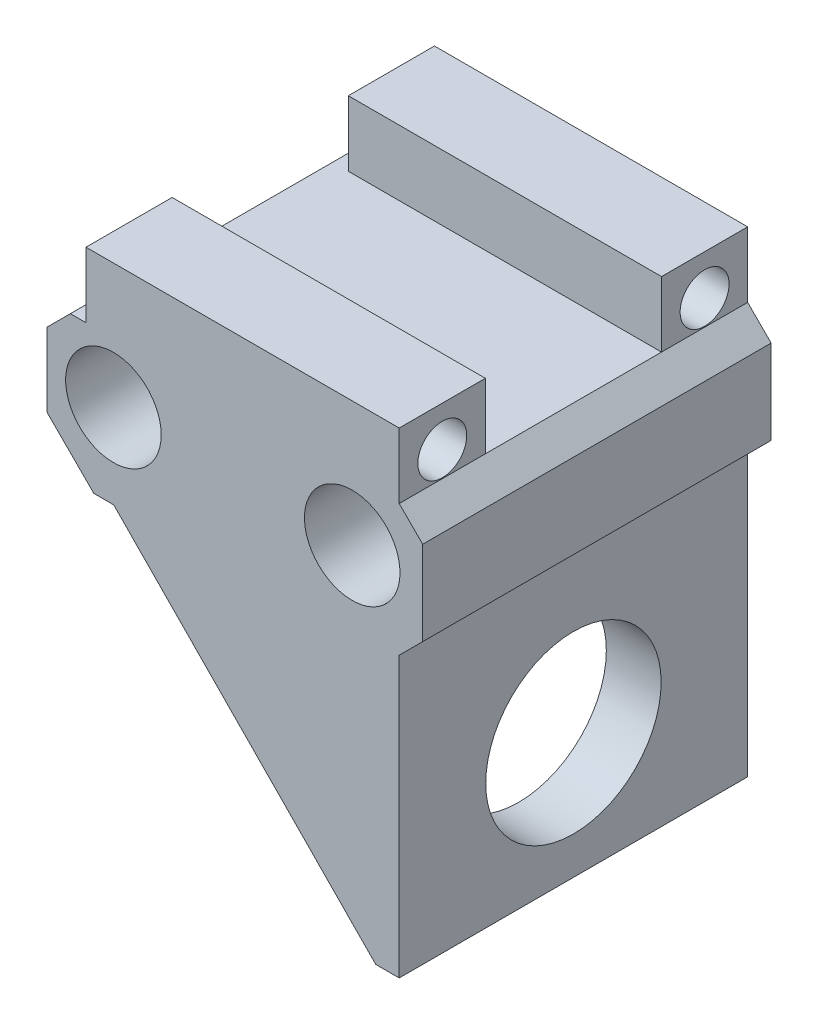
ISO-10303-21;
HEADER;
FILE_DESCRIPTION(('STEP AP214'),'2;1');
FILE_NAME('part.step','',(''),(''),'','','');
FILE_SCHEMA(('AUTOMOTIVE_DESIGN { 1 0 10303 214 1 1 1 1 }'));
ENDSEC;
DATA;
#1=APPLICATION_CONTEXT('core data for automotive mechanical design processes');
#2=APPLICATION_PROTOCOL_DEFINITION('international standard','automotive_design',2000,#1);
#3=PRODUCT_CONTEXT('',#1,'mechanical');
#4=PRODUCT('Part','Part','',(#3));
#5=PRODUCT_RELATED_PRODUCT_CATEGORY('part','',(#4));
#6=PRODUCT_DEFINITION_FORMATION('','',#4);
#7=PRODUCT_DEFINITION_CONTEXT('part definition',#1,'design');
#8=PRODUCT_DEFINITION('design','',#6,#7);
#9=PRODUCT_DEFINITION_SHAPE('','',#8);
#10=(LENGTH_UNIT() NAMED_UNIT(*) SI_UNIT(.MILLI.,.METRE.));
#11=(NAMED_UNIT(*) PLANE_ANGLE_UNIT() SI_UNIT($,.RADIAN.));
#12=(NAMED_UNIT(*) SI_UNIT($,.STERADIAN.) SOLID_ANGLE_UNIT());
#13=UNCERTAINTY_MEASURE_WITH_UNIT(LENGTH_MEASURE(1.E-05),#10,'distance_accuracy_value','');
#14=(GEOMETRIC_REPRESENTATION_CONTEXT(3) GLOBAL_UNCERTAINTY_ASSIGNED_CONTEXT((#13)) GLOBAL_UNIT_ASSIGNED_CONTEXT((#10,
#11,#12)) REPRESENTATION_CONTEXT('',''));
#15=CARTESIAN_POINT('',(0.,0.,0.));
#16=DIRECTION('',(0.,0.,1.));
#17=DIRECTION('',(1.,0.,0.));
#18=AXIS2_PLACEMENT_3D('',#15,#16,#17);
#19=CARTESIAN_POINT('',(4.59650099748462,-23.964355104519,42.5));
#20=DIRECTION('',(-1.,0.,0.));
#21=DIRECTION('',(0.,0.,1.));
#22=AXIS2_PLACEMENT_3D('',#19,#20,#21);
#23=PLANE('',#22);
#24=CARTESIAN_POINT('',(4.59650099748462,39.1139278229734,4.50000000000002));
#25=DIRECTION('',(1.,0.,0.));
#26=DIRECTION('',(0.,0.,1.));
#27=AXIS2_PLACEMENT_3D('',#24,#25,#26);
#28=CIRCLE('',#27,3.125);
#29=CARTESIAN_POINT('',(4.59650099748462,39.1139278229734,7.62500000000002));
#30=VERTEX_POINT('',#29);
#31=EDGE_CURVE('E356',#30,#30,#28,.T.);
#32=ORIENTED_EDGE('',*,*,#31,.F.);
#33=EDGE_LOOP('',(#32));
#34=FACE_BOUND('',#33,.T.);
#35=DIRECTION('',(0.,0.,1.));
#36=VECTOR('',#35,1.);
#37=CARTESIAN_POINT('',(4.59650099748462,35.885644895481,-0.999999999999994));
#38=LINE('',#37,#36);
#39=CARTESIAN_POINT('',(4.59650099748462,35.885644895481,-0.999999999999994));
#40=VERTEX_POINT('',#39);
#41=CARTESIAN_POINT('',(4.59650099748462,35.885644895481,10.));
#42=VERTEX_POINT('',#41);
#43=EDGE_CURVE('E237',#40,#42,#38,.T.);
#44=ORIENTED_EDGE('',*,*,#43,.F.);
#45=DIRECTION('',(0.,-1.,0.));
#46=VECTOR('',#45,1.);
#47=CARTESIAN_POINT('',(4.59650099748462,44.2389278229734,-1.));
#48=LINE('',#47,#46);
#49=CARTESIAN_POINT('',(4.59650099748462,44.2389278229734,-1.));
#50=VERTEX_POINT('',#49);
#51=EDGE_CURVE('E303',#50,#40,#48,.T.);
#52=ORIENTED_EDGE('',*,*,#51,.F.);
#53=DIRECTION('',(0.,0.,1.));
#54=VECTOR('',#53,1.);
#55=CARTESIAN_POINT('',(4.59650099748462,44.2389278229734,9.));
#56=LINE('',#55,#54);
#57=CARTESIAN_POINT('',(4.59650099748462,44.2389278229734,10.));
#58=VERTEX_POINT('',#57);
#59=EDGE_CURVE('E359',#50,#58,#56,.T.);
#60=ORIENTED_EDGE('',*,*,#59,.T.);
#61=DIRECTION('',(0.,-1.,0.));
#62=VECTOR('',#61,1.);
#63=CARTESIAN_POINT('',(4.59650099748462,44.2389278229734,10.));
#64=LINE('',#63,#62);
#65=EDGE_CURVE('E322',#58,#42,#64,.T.);
#66=ORIENTED_EDGE('',*,*,#65,.T.);
#67=EDGE_LOOP('',(#44,#52,#60,#66));
#68=FACE_BOUND('',#67,.T.);
#69=ADVANCED_FACE('F45',(#34,#68),#23,.F.);
#70=CARTESIAN_POINT('',(4.59650099748462,39.1139278229734,38.));
#71=DIRECTION('',(1.,0.,0.));
#72=DIRECTION('',(0.,0.,-1.));
#73=AXIS2_PLACEMENT_3D('',#70,#71,#72);
#74=CIRCLE('',#73,3.125);
#75=CARTESIAN_POINT('',(4.59650099748462,39.1139278229734,34.875));
#76=VERTEX_POINT('',#75);
#77=EDGE_CURVE('E361',#76,#76,#74,.T.);
#78=ORIENTED_EDGE('',*,*,#77,.F.);
#79=EDGE_LOOP('',(#78));
#80=FACE_BOUND('',#79,.T.);
#81=CARTESIAN_POINT('',(4.59650099748462,35.885644895481,32.5));
#82=VERTEX_POINT('',#81);
#83=CARTESIAN_POINT('',(4.59650099748462,35.885644895481,43.5));
#84=VERTEX_POINT('',#83);
#85=EDGE_CURVE('E241',#82,#84,#38,.T.);
#86=ORIENTED_EDGE('',*,*,#85,.F.);
#87=DIRECTION('',(0.,1.,0.));
#88=VECTOR('',#87,1.);
#89=CARTESIAN_POINT('',(4.59650099748462,44.2389278229734,32.5));
#90=LINE('',#89,#88);
#91=CARTESIAN_POINT('',(4.59650099748462,44.2389278229734,32.5));
#92=VERTEX_POINT('',#91);
#93=EDGE_CURVE('E328',#82,#92,#90,.T.);
#94=ORIENTED_EDGE('',*,*,#93,.T.);
#95=DIRECTION('',(0.,0.,1.));
#96=VECTOR('',#95,1.);
#97=CARTESIAN_POINT('',(4.59650099748462,44.2389278229734,33.5));
#98=LINE('',#97,#96);
#99=CARTESIAN_POINT('',(4.59650099748462,44.2389278229734,43.5));
#100=VERTEX_POINT('',#99);
#101=EDGE_CURVE('E364',#92,#100,#98,.T.);
#102=ORIENTED_EDGE('',*,*,#101,.T.);
#103=DIRECTION('',(0.,1.,0.));
#104=VECTOR('',#103,1.);
#105=CARTESIAN_POINT('',(4.59650099748462,-16.589261485104,43.5));
#106=LINE('',#105,#104);
#107=EDGE_CURVE('E316',#84,#100,#106,.T.);
#108=ORIENTED_EDGE('',*,*,#107,.F.);
#109=EDGE_LOOP('',(#86,#94,#102,#108));
#110=FACE_BOUND('',#109,.T.);
#111=ADVANCED_FACE('F419',(#80,#110),#23,.F.);
#112=CARTESIAN_POINT('',(-37.9034990025154,23.663238514896,43.5));
#113=DIRECTION('',(0.713746874568225,0.700403740027201,0.));
#114=DIRECTION('',(-0.700403740027201,0.713746874568225,0.));
#115=AXIS2_PLACEMENT_3D('',#112,#113,#114);
#116=PLANE('',#115);
#117=DIRECTION('',(0.700403740027201,-0.713746874568225,0.));
#118=VECTOR('',#117,1.);
#119=CARTESIAN_POINT('',(-37.9034990025154,23.663238514896,43.5));
#120=LINE('',#119,#118);
#121=CARTESIAN_POINT('',(-31.861912382931,17.5065558464196,43.5));
#122=VERTEX_POINT('',#121);
#123=CARTESIAN_POINT('',(1.59650099748462,-16.589261485104,43.5));
#124=VERTEX_POINT('',#123);
#125=EDGE_CURVE('E311',#122,#124,#120,.T.);
#126=ORIENTED_EDGE('',*,*,#125,.F.);
#127=DIRECTION('',(0.,0.,1.));
#128=VECTOR('',#127,1.);
#129=CARTESIAN_POINT('',(-31.861912382931,17.5065558464196,-0.999999999999994));
#130=LINE('',#129,#128);
#131=CARTESIAN_POINT('',(-31.861912382931,17.5065558464196,40.));
#132=VERTEX_POINT('',#131);
#133=EDGE_CURVE('E249',#132,#122,#130,.T.);
#134=ORIENTED_EDGE('',*,*,#133,.F.);
#135=DIRECTION('',(0.700403740027201,-0.713746874568225,0.));
#136=VECTOR('',#135,1.);
#137=CARTESIAN_POINT('',(-34.9320698642422,20.6352017708873,40.));
#138=LINE('',#137,#136);
#139=CARTESIAN_POINT('',(1.59650099748462,-16.589261485104,40.));
#140=VERTEX_POINT('',#139);
#141=EDGE_CURVE('E297',#132,#140,#138,.T.);
#142=ORIENTED_EDGE('',*,*,#141,.T.);
#143=DIRECTION('',(0.,0.,1.));
#144=VECTOR('',#143,1.);
#145=CARTESIAN_POINT('',(1.59650099748462,-16.589261485104,40.));
#146=LINE('',#145,#144);
#147=EDGE_CURVE('E340',#140,#124,#146,.T.);
#148=ORIENTED_EDGE('',*,*,#147,.T.);
#149=EDGE_LOOP('',(#126,#134,#142,#148));
#150=FACE_BOUND('',#149,.T.);
#151=ADVANCED_FACE('F426',(#150),#116,.F.);
#152=CARTESIAN_POINT('',(-2.40349900251538,44.2389278229734,32.5));
#153=DIRECTION('',(0.,0.,-1.));
#154=DIRECTION('',(-1.,0.,0.));
#155=AXIS2_PLACEMENT_3D('',#152,#153,#154);
#156=PLANE('',#155);
#157=DIRECTION('',(1.,0.,0.));
#158=VECTOR('',#157,1.);
#159=CARTESIAN_POINT('',(-38.4034990025154,35.885644895481,32.5));
#160=LINE('',#159,#158);
#161=CARTESIAN_POINT('',(-35.4034990025154,35.885644895481,32.5));
#162=VERTEX_POINT('',#161);
#163=EDGE_CURVE('E267',#162,#82,#160,.T.);
#164=ORIENTED_EDGE('',*,*,#163,.F.);
#165=DIRECTION('',(0.,1.,0.));
#166=VECTOR('',#165,1.);
#167=CARTESIAN_POINT('',(-35.4034990025154,44.2389278229734,32.5));
#168=LINE('',#167,#166);
#169=CARTESIAN_POINT('',(-35.4034990025154,44.2389278229734,32.5));
#170=VERTEX_POINT('',#169);
#171=EDGE_CURVE('E289',#162,#170,#168,.T.);
#172=ORIENTED_EDGE('',*,*,#171,.T.);
#173=DIRECTION('',(1.,0.,0.));
#174=VECTOR('',#173,1.);
#175=CARTESIAN_POINT('',(-2.40349900251538,44.2389278229734,32.5));
#176=LINE('',#175,#174);
#177=EDGE_CURVE('E330',#170,#92,#176,.T.);
#178=ORIENTED_EDGE('',*,*,#177,.T.);
#179=ORIENTED_EDGE('',*,*,#93,.F.);
#180=EDGE_LOOP('',(#164,#172,#178,#179));
#181=FACE_BOUND('',#180,.T.);
#182=ADVANCED_FACE('F501',(#181),#156,.T.);
#183=CARTESIAN_POINT('',(-2.40349900251538,44.2389278229734,10.));
#184=DIRECTION('',(0.,0.,1.));
#185=DIRECTION('',(1.,0.,0.));
#186=AXIS2_PLACEMENT_3D('',#183,#184,#185);
#187=PLANE('',#186);
#188=DIRECTION('',(1.,0.,0.));
#189=VECTOR('',#188,1.);
#190=CARTESIAN_POINT('',(-38.4034990025154,35.885644895481,10.));
#191=LINE('',#190,#189);
#192=CARTESIAN_POINT('',(-35.4034990025154,35.885644895481,10.));
#193=VERTEX_POINT('',#192);
#194=EDGE_CURVE('E266',#193,#42,#191,.T.);
#195=ORIENTED_EDGE('',*,*,#194,.T.);
#196=ORIENTED_EDGE('',*,*,#65,.F.);
#197=DIRECTION('',(1.,0.,0.));
#198=VECTOR('',#197,1.);
#199=CARTESIAN_POINT('',(-2.40349900251538,44.2389278229734,10.));
#200=LINE('',#199,#198);
#201=CARTESIAN_POINT('',(-35.4034990025154,44.2389278229734,10.));
#202=VERTEX_POINT('',#201);
#203=EDGE_CURVE('E325',#202,#58,#200,.T.);
#204=ORIENTED_EDGE('',*,*,#203,.F.);
#205=DIRECTION('',(0.,-1.,0.));
#206=VECTOR('',#205,1.);
#207=CARTESIAN_POINT('',(-35.4034990025154,30.5689278229734,10.));
#208=LINE('',#207,#206);
#209=EDGE_CURVE('E275',#202,#193,#208,.T.);
#210=ORIENTED_EDGE('',*,*,#209,.T.);
#211=EDGE_LOOP('',(#195,#196,#204,#210));
#212=FACE_BOUND('',#211,.T.);
#213=ADVANCED_FACE('F443',(#212),#187,.T.);
#214=CARTESIAN_POINT('',(1.59650099748462,0.,0.));
#215=DIRECTION('',(1.,0.,0.));
#216=DIRECTION('',(0.,0.,-1.));
#217=AXIS2_PLACEMENT_3D('',#214,#215,#216);
#218=PLANE('',#217);
#219=CARTESIAN_POINT('',(1.59650099748462,-0.589261485104013,21.25));
#220=DIRECTION('',(1.,0.,0.));
#221=DIRECTION('',(0.,0.,-1.));
#222=AXIS2_PLACEMENT_3D('',#219,#220,#221);
#223=CIRCLE('',#222,13.75);
#224=CARTESIAN_POINT('',(1.59650099748462,-0.589261485104013,7.50000000000001));
#225=VERTEX_POINT('',#224);
#226=EDGE_CURVE('E367',#225,#225,#223,.F.);
#227=ORIENTED_EDGE('',*,*,#226,.F.);
#228=EDGE_LOOP('',(#227));
#229=FACE_BOUND('',#228,.T.);
#230=DIRECTION('',(0.,1.,0.));
#231=VECTOR('',#230,1.);
#232=CARTESIAN_POINT('',(1.59650099748462,-16.589261485104,40.));
#233=LINE('',#232,#231);
#234=CARTESIAN_POINT('',(1.59650099748461,17.5065558464196,40.));
#235=VERTEX_POINT('',#234);
#236=EDGE_CURVE('E337',#140,#235,#233,.T.);
#237=ORIENTED_EDGE('',*,*,#236,.T.);
#238=DIRECTION('',(0.,0.,-1.));
#239=VECTOR('',#238,1.);
#240=CARTESIAN_POINT('',(1.59650099748462,17.5065558464196,0.));
#241=LINE('',#240,#239);
#242=CARTESIAN_POINT('',(1.59650099748461,17.5065558464196,2.5));
#243=VERTEX_POINT('',#242);
#244=EDGE_CURVE('E221',#235,#243,#241,.T.);
#245=ORIENTED_EDGE('',*,*,#244,.T.);
#246=DIRECTION('',(0.,-1.,0.));
#247=VECTOR('',#246,1.);
#248=CARTESIAN_POINT('',(1.59650099748462,20.663238514896,2.5));
#249=LINE('',#248,#247);
#250=CARTESIAN_POINT('',(1.59650099748462,-16.589261485104,2.5));
#251=VERTEX_POINT('',#250);
#252=EDGE_CURVE('E335',#243,#251,#249,.T.);
#253=ORIENTED_EDGE('',*,*,#252,.T.);
#254=DIRECTION('',(0.,0.,1.));
#255=VECTOR('',#254,1.);
#256=CARTESIAN_POINT('',(1.59650099748462,-16.589261485104,42.5));
#257=LINE('',#256,#255);
#258=EDGE_CURVE('E349',#251,#140,#257,.T.);
#259=ORIENTED_EDGE('',*,*,#258,.T.);
#260=EDGE_LOOP('',(#237,#245,#253,#259));
#261=FACE_BOUND('',#260,.T.);
#262=ADVANCED_FACE('F434',(#229,#261),#218,.F.);
#263=DIRECTION('',(0.,0.,1.));
#264=VECTOR('',#263,1.);
#265=CARTESIAN_POINT('',(4.59650099748462,19.1143111816818,-0.999999999999994));
#266=LINE('',#265,#264);
#267=CARTESIAN_POINT('',(4.59650099748462,19.1143111816818,-0.999999999999994));
#268=VERTEX_POINT('',#267);
#269=CARTESIAN_POINT('',(4.59650099748462,19.1143111816818,43.5));
#270=VERTEX_POINT('',#269);
#271=EDGE_CURVE('E193',#268,#270,#266,.T.);
#272=ORIENTED_EDGE('',*,*,#271,.T.);
#273=CARTESIAN_POINT('',(4.59650099748462,-16.589261485104,43.5));
#274=VERTEX_POINT('',#273);
#275=EDGE_CURVE('E317',#274,#270,#106,.T.);
#276=ORIENTED_EDGE('',*,*,#275,.F.);
#277=DIRECTION('',(0.,0.,1.));
#278=VECTOR('',#277,1.);
#279=CARTESIAN_POINT('',(4.59650099748462,-16.589261485104,0.));
#280=LINE('',#279,#278);
#281=CARTESIAN_POINT('',(4.59650099748462,-16.589261485104,-1.));
#282=VERTEX_POINT('',#281);
#283=EDGE_CURVE('E333',#282,#274,#280,.T.);
#284=ORIENTED_EDGE('',*,*,#283,.F.);
#285=EDGE_CURVE('E302',#268,#282,#48,.T.);
#286=ORIENTED_EDGE('',*,*,#285,.F.);
#287=EDGE_LOOP('',(#272,#276,#284,#286));
#288=FACE_BOUND('',#287,.T.);
#289=CARTESIAN_POINT('',(4.59650099748462,-0.589261485104013,21.25));
#290=DIRECTION('',(1.,0.,0.));
#291=DIRECTION('',(0.,0.,-1.));
#292=AXIS2_PLACEMENT_3D('',#289,#290,#291);
#293=CIRCLE('',#292,11.2);
#294=CARTESIAN_POINT('',(4.59650099748462,-0.589261485104013,10.05));
#295=VERTEX_POINT('',#294);
#296=EDGE_CURVE('E353',#295,#295,#293,.T.);
#297=ORIENTED_EDGE('',*,*,#296,.F.);
#298=EDGE_LOOP('',(#297));
#299=FACE_BOUND('',#298,.T.);
#300=ADVANCED_FACE('F422',(#288,#299),#23,.F.);
#301=CARTESIAN_POINT('',(-0.403499002515381,44.2389278229734,33.5));
#302=DIRECTION('',(0.,1.,0.));
#303=DIRECTION('',(0.,0.,1.));
#304=AXIS2_PLACEMENT_3D('',#301,#302,#303);
#305=PLANE('',#304);
#306=ORIENTED_EDGE('',*,*,#101,.F.);
#307=ORIENTED_EDGE('',*,*,#177,.F.);
#308=DIRECTION('',(0.,0.,1.));
#309=VECTOR('',#308,1.);
#310=CARTESIAN_POINT('',(-35.4034990025154,44.2389278229734,43.5));
#311=LINE('',#310,#309);
#312=CARTESIAN_POINT('',(-35.4034990025154,44.2389278229734,43.5));
#313=VERTEX_POINT('',#312);
#314=EDGE_CURVE('E291',#170,#313,#311,.T.);
#315=ORIENTED_EDGE('',*,*,#314,.T.);
#316=DIRECTION('',(-1.,0.,0.));
#317=VECTOR('',#316,1.);
#318=CARTESIAN_POINT('',(4.59650099748462,44.2389278229734,43.5));
#319=LINE('',#318,#317);
#320=EDGE_CURVE('E320',#100,#313,#319,.T.);
#321=ORIENTED_EDGE('',*,*,#320,.F.);
#322=EDGE_LOOP('',(#306,#307,#315,#321));
#323=FACE_BOUND('',#322,.T.);
#324=ADVANCED_FACE('F433',(#323),#305,.T.);
#325=CARTESIAN_POINT('',(-0.403499002515381,39.1139278229734,38.));
#326=DIRECTION('',(1.,0.,0.));
#327=DIRECTION('',(0.,0.,-1.));
#328=AXIS2_PLACEMENT_3D('',#325,#326,#327);
#329=CYLINDRICAL_SURFACE('',#328,3.125);
#330=ORIENTED_EDGE('',*,*,#77,.T.);
#331=EDGE_LOOP('',(#330));
#332=FACE_BOUND('',#331,.T.);
#333=CARTESIAN_POINT('',(-35.4034990025154,39.1139278229734,38.));
#334=DIRECTION('',(1.,0.,0.));
#335=DIRECTION('',(0.,0.,-1.));
#336=AXIS2_PLACEMENT_3D('',#333,#334,#335);
#337=CIRCLE('',#336,3.125);
#338=CARTESIAN_POINT('',(-35.4034990025154,39.1139278229734,34.875));
#339=VERTEX_POINT('',#338);
#340=EDGE_CURVE('E283',#339,#339,#337,.T.);
#341=ORIENTED_EDGE('',*,*,#340,.F.);
#342=EDGE_LOOP('',(#341));
#343=FACE_BOUND('',#342,.T.);
#344=ADVANCED_FACE('F440',(#332,#343),#329,.F.);
#345=CARTESIAN_POINT('',(-0.403499002515381,44.2389278229734,9.));
#346=DIRECTION('',(0.,1.,0.));
#347=DIRECTION('',(0.,0.,1.));
#348=AXIS2_PLACEMENT_3D('',#345,#346,#347);
#349=PLANE('',#348);
#350=ORIENTED_EDGE('',*,*,#59,.F.);
#351=DIRECTION('',(1.,0.,0.));
#352=VECTOR('',#351,1.);
#353=CARTESIAN_POINT('',(-2.40349900251538,44.2389278229734,-1.));
#354=LINE('',#353,#352);
#355=CARTESIAN_POINT('',(-35.4034990025154,44.2389278229734,-1.));
#356=VERTEX_POINT('',#355);
#357=EDGE_CURVE('E299',#356,#50,#354,.T.);
#358=ORIENTED_EDGE('',*,*,#357,.F.);
#359=DIRECTION('',(0.,0.,1.));
#360=VECTOR('',#359,1.);
#361=CARTESIAN_POINT('',(-35.4034990025154,44.2389278229734,10.));
#362=LINE('',#361,#360);
#363=EDGE_CURVE('E280',#356,#202,#362,.T.);
#364=ORIENTED_EDGE('',*,*,#363,.T.);
#365=ORIENTED_EDGE('',*,*,#203,.T.);
#366=EDGE_LOOP('',(#350,#358,#364,#365));
#367=FACE_BOUND('',#366,.T.);
#368=ADVANCED_FACE('F476',(#367),#349,.T.);
#369=CARTESIAN_POINT('',(-0.403499002515381,39.1139278229734,4.50000000000002));
#370=DIRECTION('',(1.,0.,0.));
#371=DIRECTION('',(0.,0.,-1.));
#372=AXIS2_PLACEMENT_3D('',#369,#370,#371);
#373=CYLINDRICAL_SURFACE('',#372,3.125);
#374=ORIENTED_EDGE('',*,*,#31,.T.);
#375=EDGE_LOOP('',(#374));
#376=FACE_BOUND('',#375,.T.);
#377=CARTESIAN_POINT('',(-35.4034990025154,39.1139278229734,4.50000000000002));
#378=DIRECTION('',(1.,0.,0.));
#379=DIRECTION('',(0.,0.,-1.));
#380=AXIS2_PLACEMENT_3D('',#377,#378,#379);
#381=CIRCLE('',#380,3.125);
#382=CARTESIAN_POINT('',(-35.4034990025154,39.1139278229734,1.37500000000002));
#383=VERTEX_POINT('',#382);
#384=EDGE_CURVE('E270',#383,#383,#381,.T.);
#385=ORIENTED_EDGE('',*,*,#384,.F.);
#386=EDGE_LOOP('',(#385));
#387=FACE_BOUND('',#386,.T.);
#388=ADVANCED_FACE('F453',(#376,#387),#373,.F.);
#389=CARTESIAN_POINT('',(1.59650099748462,-0.589261485104013,21.25));
#390=DIRECTION('',(1.,0.,0.));
#391=DIRECTION('',(0.,0.,-1.));
#392=AXIS2_PLACEMENT_3D('',#389,#390,#391);
#393=CYLINDRICAL_SURFACE('',#392,11.2);
#394=ORIENTED_EDGE('',*,*,#296,.T.);
#395=EDGE_LOOP('',(#394));
#396=FACE_BOUND('',#395,.T.);
#397=CARTESIAN_POINT('',(-2.40349900251538,-0.589261485104013,21.25));
#398=DIRECTION('',(-1.,0.,0.));
#399=DIRECTION('',(0.,0.,1.));
#400=AXIS2_PLACEMENT_3D('',#397,#398,#399);
#401=CIRCLE('',#400,11.2);
#402=CARTESIAN_POINT('',(-2.40349900251538,-0.589261485104013,32.45));
#403=VERTEX_POINT('',#402);
#404=EDGE_CURVE('E343',#403,#403,#401,.T.);
#405=ORIENTED_EDGE('',*,*,#404,.T.);
#406=EDGE_LOOP('',(#405));
#407=FACE_BOUND('',#406,.T.);
#408=ADVANCED_FACE('F449',(#396,#407),#393,.F.);
#409=CARTESIAN_POINT('',(1.59650099748462,-16.589261485104,42.5));
#410=DIRECTION('',(0.,1.,0.));
#411=DIRECTION('',(0.,0.,1.));
#412=AXIS2_PLACEMENT_3D('',#409,#410,#411);
#413=PLANE('',#412);
#414=CARTESIAN_POINT('',(1.59650099748462,-16.589261485104,-1.));
#415=VERTEX_POINT('',#414);
#416=EDGE_CURVE('E350',#415,#251,#257,.T.);
#417=ORIENTED_EDGE('',*,*,#416,.F.);
#418=DIRECTION('',(-1.,0.,0.));
#419=VECTOR('',#418,1.);
#420=CARTESIAN_POINT('',(4.59650099748462,-16.589261485104,-1.));
#421=LINE('',#420,#419);
#422=EDGE_CURVE('E305',#282,#415,#421,.T.);
#423=ORIENTED_EDGE('',*,*,#422,.F.);
#424=ORIENTED_EDGE('',*,*,#283,.T.);
#425=DIRECTION('',(1.,0.,0.));
#426=VECTOR('',#425,1.);
#427=CARTESIAN_POINT('',(1.59650099748462,-16.589261485104,43.5));
#428=LINE('',#427,#426);
#429=EDGE_CURVE('E313',#124,#274,#428,.T.);
#430=ORIENTED_EDGE('',*,*,#429,.F.);
#431=ORIENTED_EDGE('',*,*,#147,.F.);
#432=ORIENTED_EDGE('',*,*,#258,.F.);
#433=EDGE_LOOP('',(#417,#423,#424,#430,#431,#432));
#434=FACE_BOUND('',#433,.T.);
#435=ADVANCED_FACE('F452',(#434),#413,.F.);
#436=CARTESIAN_POINT('',(-2.40349900251538,-0.589261485104013,21.25));
#437=DIRECTION('',(-1.,0.,0.));
#438=DIRECTION('',(0.,0.,1.));
#439=AXIS2_PLACEMENT_3D('',#436,#437,#438);
#440=PLANE('',#439);
#441=CARTESIAN_POINT('',(-2.40349900251538,-0.589261485104013,21.25));
#442=DIRECTION('',(-1.,0.,0.));
#443=DIRECTION('',(0.,0.,1.));
#444=AXIS2_PLACEMENT_3D('',#441,#442,#443);
#445=CIRCLE('',#444,13.75);
#446=CARTESIAN_POINT('',(-2.40349900251538,-0.589261485104013,35.));
#447=VERTEX_POINT('',#446);
#448=EDGE_CURVE('E346',#447,#447,#445,.T.);
#449=ORIENTED_EDGE('',*,*,#448,.T.);
#450=EDGE_LOOP('',(#449));
#451=FACE_BOUND('',#450,.T.);
#452=ORIENTED_EDGE('',*,*,#404,.F.);
#453=EDGE_LOOP('',(#452));
#454=FACE_BOUND('',#453,.T.);
#455=ADVANCED_FACE('F457',(#451,#454),#440,.T.);
#456=CARTESIAN_POINT('',(-2.40349900251538,-0.589261485104013,21.25));
#457=DIRECTION('',(1.,0.,0.));
#458=DIRECTION('',(0.,0.,-1.));
#459=AXIS2_PLACEMENT_3D('',#456,#457,#458);
#460=CYLINDRICAL_SURFACE('',#459,13.75);
#461=ORIENTED_EDGE('',*,*,#448,.F.);
#462=EDGE_LOOP('',(#461));
#463=FACE_BOUND('',#462,.T.);
#464=ORIENTED_EDGE('',*,*,#226,.T.);
#465=EDGE_LOOP('',(#464));
#466=FACE_BOUND('',#465,.T.);
#467=ADVANCED_FACE('F459',(#463,#466),#460,.T.);
#468=CARTESIAN_POINT('',(0.,0.,40.));
#469=DIRECTION('',(0.,0.,-1.));
#470=DIRECTION('',(-1.,0.,0.));
#471=AXIS2_PLACEMENT_3D('',#468,#469,#470);
#472=PLANE('',#471);
#473=DIRECTION('',(1.,0.,0.));
#474=VECTOR('',#473,1.);
#475=CARTESIAN_POINT('',(-33.9034990025154,17.5065558464196,40.));
#476=LINE('',#475,#474);
#477=EDGE_CURVE('E218',#132,#235,#476,.T.);
#478=ORIENTED_EDGE('',*,*,#477,.T.);
#479=ORIENTED_EDGE('',*,*,#236,.F.);
#480=ORIENTED_EDGE('',*,*,#141,.F.);
#481=EDGE_LOOP('',(#478,#479,#480));
#482=FACE_BOUND('',#481,.T.);
#483=ADVANCED_FACE('F466',(#482),#472,.T.);
#484=CARTESIAN_POINT('',(0.,0.,2.5));
#485=DIRECTION('',(0.,0.,-1.));
#486=DIRECTION('',(-1.,0.,0.));
#487=AXIS2_PLACEMENT_3D('',#484,#485,#486);
#488=PLANE('',#487);
#489=ORIENTED_EDGE('',*,*,#252,.F.);
#490=DIRECTION('',(1.,0.,0.));
#491=VECTOR('',#490,1.);
#492=CARTESIAN_POINT('',(-33.9034990025154,17.5065558464196,2.5));
#493=LINE('',#492,#491);
#494=CARTESIAN_POINT('',(-31.861912382931,17.5065558464196,2.5));
#495=VERTEX_POINT('',#494);
#496=EDGE_CURVE('E216',#495,#243,#493,.T.);
#497=ORIENTED_EDGE('',*,*,#496,.F.);
#498=DIRECTION('',(-0.700403740027201,0.713746874568225,0.));
#499=VECTOR('',#498,1.);
#500=CARTESIAN_POINT('',(1.59650099748462,-16.589261485104,2.5));
#501=LINE('',#500,#499);
#502=EDGE_CURVE('E294',#251,#495,#501,.T.);
#503=ORIENTED_EDGE('',*,*,#502,.F.);
#504=EDGE_LOOP('',(#489,#497,#503));
#505=FACE_BOUND('',#504,.T.);
#506=ADVANCED_FACE('F523',(#505),#488,.F.);
#507=CARTESIAN_POINT('',(0.,0.,43.5));
#508=DIRECTION('',(0.,0.,1.));
#509=DIRECTION('',(1.,0.,0.));
#510=AXIS2_PLACEMENT_3D('',#507,#508,#509);
#511=PLANE('',#510);
#512=CARTESIAN_POINT('',(-31.9034990025154,28.265832134311,43.5));
#513=DIRECTION('',(0.,0.,1.));
#514=DIRECTION('',(1.,0.,0.));
#515=AXIS2_PLACEMENT_3D('',#512,#513,#514);
#516=CIRCLE('',#515,6.1);
#517=CARTESIAN_POINT('',(-25.8034990025154,28.265832134311,43.5));
#518=VERTEX_POINT('',#517);
#519=EDGE_CURVE('E229',#518,#518,#516,.T.);
#520=ORIENTED_EDGE('',*,*,#519,.F.);
#521=EDGE_LOOP('',(#520));
#522=FACE_BOUND('',#521,.T.);
#523=CARTESIAN_POINT('',(-1.40349900251539,28.265832134311,43.5));
#524=DIRECTION('',(0.,0.,1.));
#525=DIRECTION('',(1.,0.,0.));
#526=AXIS2_PLACEMENT_3D('',#523,#524,#525);
#527=CIRCLE('',#526,6.1);
#528=CARTESIAN_POINT('',(4.69650099748461,28.265832134311,43.5));
#529=VERTEX_POINT('',#528);
#530=EDGE_CURVE('E225',#529,#529,#527,.T.);
#531=ORIENTED_EDGE('',*,*,#530,.F.);
#532=EDGE_LOOP('',(#531));
#533=FACE_BOUND('',#532,.T.);
#534=DIRECTION('',(0.,-1.,0.));
#535=VECTOR('',#534,1.);
#536=CARTESIAN_POINT('',(-40.4034990025154,21.4593237857399,43.5));
#537=LINE('',#536,#535);
#538=CARTESIAN_POINT('',(-40.4034990025154,32.8856448954809,43.5));
#539=VERTEX_POINT('',#538);
#540=CARTESIAN_POINT('',(-40.4034990025154,23.5065558464196,43.5));
#541=VERTEX_POINT('',#540);
#542=EDGE_CURVE('E240',#539,#541,#537,.T.);
#543=ORIENTED_EDGE('',*,*,#542,.T.);
#544=DIRECTION('',(-0.707106781186548,0.707106781186547,0.));
#545=VECTOR('',#544,1.);
#546=CARTESIAN_POINT('',(-8.44847157804786,-8.44847157804788,43.5));
#547=LINE('',#546,#545);
#548=CARTESIAN_POINT('',(-34.4034990025154,17.5065558464196,43.5));
#549=VERTEX_POINT('',#548);
#550=EDGE_CURVE('E68',#541,#549,#547,.F.);
#551=ORIENTED_EDGE('',*,*,#550,.T.);
#552=DIRECTION('',(1.,0.,0.));
#553=VECTOR('',#552,1.);
#554=CARTESIAN_POINT('',(-40.4034990025154,17.5065558464196,43.5));
#555=LINE('',#554,#553);
#556=EDGE_CURVE('E247',#549,#122,#555,.T.);
#557=ORIENTED_EDGE('',*,*,#556,.T.);
#558=ORIENTED_EDGE('',*,*,#125,.T.);
#559=ORIENTED_EDGE('',*,*,#429,.T.);
#560=ORIENTED_EDGE('',*,*,#275,.T.);
#561=DIRECTION('',(-0.707106781186545,-0.70710678118655,0.));
#562=VECTOR('',#561,1.);
#563=CARTESIAN_POINT('',(-7.25890509209857,7.25890509209852,43.5));
#564=LINE('',#563,#562);
#565=CARTESIAN_POINT('',(7.59650099748462,22.1143111816818,43.5));
#566=VERTEX_POINT('',#565);
#567=EDGE_CURVE('E372',#270,#566,#564,.F.);
#568=ORIENTED_EDGE('',*,*,#567,.T.);
#569=DIRECTION('',(0.,1.,0.));
#570=VECTOR('',#569,1.);
#571=CARTESIAN_POINT('',(7.59650099748462,32.8856448954809,43.5));
#572=LINE('',#571,#570);
#573=CARTESIAN_POINT('',(7.59650099748462,32.8856448954809,43.5));
#574=VERTEX_POINT('',#573);
#575=EDGE_CURVE('E206',#566,#574,#572,.T.);
#576=ORIENTED_EDGE('',*,*,#575,.T.);
#577=DIRECTION('',(0.707106781186546,-0.707106781186549,0.));
#578=VECTOR('',#577,1.);
#579=CARTESIAN_POINT('',(20.2410729464828,20.2410729464827,43.5));
#580=LINE('',#579,#578);
#581=EDGE_CURVE('E370',#574,#84,#580,.F.);
#582=ORIENTED_EDGE('',*,*,#581,.T.);
#583=ORIENTED_EDGE('',*,*,#107,.T.);
#584=ORIENTED_EDGE('',*,*,#320,.T.);
#585=DIRECTION('',(0.,-1.,0.));
#586=VECTOR('',#585,1.);
#587=CARTESIAN_POINT('',(-35.4034990025154,44.2389278229734,43.5));
#588=LINE('',#587,#586);
#589=CARTESIAN_POINT('',(-35.4034990025154,35.885644895481,43.5));
#590=VERTEX_POINT('',#589);
#591=EDGE_CURVE('E286',#313,#590,#588,.T.);
#592=ORIENTED_EDGE('',*,*,#591,.T.);
#593=DIRECTION('',(-1.,0.,0.));
#594=VECTOR('',#593,1.);
#595=CARTESIAN_POINT('',(-38.4034990025154,35.885644895481,43.5));
#596=LINE('',#595,#594);
#597=CARTESIAN_POINT('',(-37.4034990025154,35.885644895481,43.5));
#598=VERTEX_POINT('',#597);
#599=EDGE_CURVE('E255',#590,#598,#596,.T.);
#600=ORIENTED_EDGE('',*,*,#599,.T.);
#601=DIRECTION('',(0.707106781186545,0.70710678118655,0.));
#602=VECTOR('',#601,1.);
#603=CARTESIAN_POINT('',(-36.6445719489983,36.644571948998,43.5));
#604=LINE('',#603,#602);
#605=EDGE_CURVE('E379',#598,#539,#604,.F.);
#606=ORIENTED_EDGE('',*,*,#605,.T.);
#607=EDGE_LOOP('',(#543,#551,#557,#558,#559,#560,#568,#576,#582,#583,#584,#592,#600,#606));
#608=FACE_BOUND('',#607,.T.);
#609=ADVANCED_FACE('F396',(#522,#533,#608),#511,.T.);
#610=ORIENTED_EDGE('',*,*,#502,.T.);
#611=CARTESIAN_POINT('',(-31.861912382931,17.5065558464196,-0.999999999999994));
#612=VERTEX_POINT('',#611);
#613=EDGE_CURVE('E252',#612,#495,#130,.T.);
#614=ORIENTED_EDGE('',*,*,#613,.F.);
#615=DIRECTION('',(-0.700403740027201,0.713746874568225,0.));
#616=VECTOR('',#615,1.);
#617=CARTESIAN_POINT('',(1.59650099748462,-16.589261485104,-1.));
#618=LINE('',#617,#616);
#619=EDGE_CURVE('E308',#415,#612,#618,.T.);
#620=ORIENTED_EDGE('',*,*,#619,.F.);
#621=ORIENTED_EDGE('',*,*,#416,.T.);
#622=EDGE_LOOP('',(#610,#614,#620,#621));
#623=FACE_BOUND('',#622,.T.);
#624=ADVANCED_FACE('F521',(#623),#116,.F.);
#625=CARTESIAN_POINT('',(0.,0.,-1.));
#626=DIRECTION('',(0.,0.,-1.));
#627=DIRECTION('',(-1.,0.,0.));
#628=AXIS2_PLACEMENT_3D('',#625,#626,#627);
#629=PLANE('',#628);
#630=CARTESIAN_POINT('',(-31.9034990025154,28.265832134311,-0.999999999999994));
#631=DIRECTION('',(0.,0.,1.));
#632=DIRECTION('',(1.,0.,0.));
#633=AXIS2_PLACEMENT_3D('',#630,#631,#632);
#634=CIRCLE('',#633,6.1);
#635=CARTESIAN_POINT('',(-25.8034990025154,28.265832134311,-0.999999999999994));
#636=VERTEX_POINT('',#635);
#637=EDGE_CURVE('E226',#636,#636,#634,.T.);
#638=ORIENTED_EDGE('',*,*,#637,.T.);
#639=EDGE_LOOP('',(#638));
#640=FACE_BOUND('',#639,.T.);
#641=CARTESIAN_POINT('',(-1.40349900251539,28.265832134311,-0.999999999999994));
#642=DIRECTION('',(0.,0.,1.));
#643=DIRECTION('',(1.,0.,0.));
#644=AXIS2_PLACEMENT_3D('',#641,#642,#643);
#645=CIRCLE('',#644,6.1);
#646=CARTESIAN_POINT('',(4.69650099748461,28.265832134311,-0.999999999999994));
#647=VERTEX_POINT('',#646);
#648=EDGE_CURVE('E232',#647,#647,#645,.T.);
#649=ORIENTED_EDGE('',*,*,#648,.T.);
#650=EDGE_LOOP('',(#649));
#651=FACE_BOUND('',#650,.T.);
#652=DIRECTION('',(1.,0.,0.));
#653=VECTOR('',#652,1.);
#654=CARTESIAN_POINT('',(-40.4034990025154,17.5065558464196,-0.999999999999994));
#655=LINE('',#654,#653);
#656=CARTESIAN_POINT('',(-34.4034990025154,17.5065558464196,-0.999999999999994));
#657=VERTEX_POINT('',#656);
#658=EDGE_CURVE('E246',#657,#612,#655,.T.);
#659=ORIENTED_EDGE('',*,*,#658,.F.);
#660=DIRECTION('',(0.707106781186548,-0.707106781186547,0.));
#661=VECTOR('',#660,1.);
#662=CARTESIAN_POINT('',(-8.44847157804786,-8.44847157804788,-1.));
#663=LINE('',#662,#661);
#664=CARTESIAN_POINT('',(-40.4034990025154,23.5065558464196,-0.999999999999994));
#665=VERTEX_POINT('',#664);
#666=EDGE_CURVE('E11',#657,#665,#663,.F.);
#667=ORIENTED_EDGE('',*,*,#666,.T.);
#668=DIRECTION('',(0.,-1.,0.));
#669=VECTOR('',#668,1.);
#670=CARTESIAN_POINT('',(-40.4034990025154,35.885644895481,-0.999999999999994));
#671=LINE('',#670,#669);
#672=CARTESIAN_POINT('',(-40.4034990025154,32.8856448954809,-0.999999999999994));
#673=VERTEX_POINT('',#672);
#674=EDGE_CURVE('E243',#673,#665,#671,.T.);
#675=ORIENTED_EDGE('',*,*,#674,.F.);
#676=DIRECTION('',(-0.707106781186545,-0.70710678118655,0.));
#677=VECTOR('',#676,1.);
#678=CARTESIAN_POINT('',(-36.6445719489983,36.644571948998,-1.));
#679=LINE('',#678,#677);
#680=CARTESIAN_POINT('',(-37.4034990025154,35.885644895481,-0.999999999999994));
#681=VERTEX_POINT('',#680);
#682=EDGE_CURVE('E383',#673,#681,#679,.F.);
#683=ORIENTED_EDGE('',*,*,#682,.T.);
#684=DIRECTION('',(-1.,0.,0.));
#685=VECTOR('',#684,1.);
#686=CARTESIAN_POINT('',(-38.4034990025154,35.885644895481,-0.999999999999994));
#687=LINE('',#686,#685);
#688=CARTESIAN_POINT('',(-35.4034990025154,35.885644895481,-1.));
#689=VERTEX_POINT('',#688);
#690=EDGE_CURVE('E256',#689,#681,#687,.T.);
#691=ORIENTED_EDGE('',*,*,#690,.F.);
#692=DIRECTION('',(0.,1.,0.));
#693=VECTOR('',#692,1.);
#694=CARTESIAN_POINT('',(-35.4034990025154,44.2389278229734,-1.));
#695=LINE('',#694,#693);
#696=EDGE_CURVE('E278',#689,#356,#695,.T.);
#697=ORIENTED_EDGE('',*,*,#696,.T.);
#698=ORIENTED_EDGE('',*,*,#357,.T.);
#699=ORIENTED_EDGE('',*,*,#51,.T.);
#700=DIRECTION('',(-0.707106781186546,0.707106781186549,0.));
#701=VECTOR('',#700,1.);
#702=CARTESIAN_POINT('',(20.2410729464828,20.2410729464827,-1.));
#703=LINE('',#702,#701);
#704=CARTESIAN_POINT('',(7.59650099748462,32.8856448954809,-0.999999999999994));
#705=VERTEX_POINT('',#704);
#706=EDGE_CURVE('E198',#40,#705,#703,.F.);
#707=ORIENTED_EDGE('',*,*,#706,.T.);
#708=DIRECTION('',(0.,1.,0.));
#709=VECTOR('',#708,1.);
#710=CARTESIAN_POINT('',(7.59650099748462,32.8856448954809,-0.999999999999994));
#711=LINE('',#710,#709);
#712=CARTESIAN_POINT('',(7.59650099748462,22.1143111816818,-0.999999999999994));
#713=VERTEX_POINT('',#712);
#714=EDGE_CURVE('E204',#713,#705,#711,.T.);
#715=ORIENTED_EDGE('',*,*,#714,.F.);
#716=DIRECTION('',(0.707106781186545,0.70710678118655,0.));
#717=VECTOR('',#716,1.);
#718=CARTESIAN_POINT('',(-7.25890509209857,7.25890509209852,-1.));
#719=LINE('',#718,#717);
#720=EDGE_CURVE('E187',#713,#268,#719,.F.);
#721=ORIENTED_EDGE('',*,*,#720,.T.);
#722=ORIENTED_EDGE('',*,*,#285,.T.);
#723=ORIENTED_EDGE('',*,*,#422,.T.);
#724=ORIENTED_EDGE('',*,*,#619,.T.);
#725=EDGE_LOOP('',(#659,#667,#675,#683,#691,#697,#698,#699,#707,#715,#721,#722,#723,#724));
#726=FACE_BOUND('',#725,.T.);
#727=ADVANCED_FACE('F209',(#640,#651,#726),#629,.T.);
#728=CARTESIAN_POINT('',(-35.4034990025154,0.,0.));
#729=DIRECTION('',(1.,0.,0.));
#730=DIRECTION('',(0.,0.,-1.));
#731=AXIS2_PLACEMENT_3D('',#728,#729,#730);
#732=PLANE('',#731);
#733=ORIENTED_EDGE('',*,*,#340,.T.);
#734=EDGE_LOOP('',(#733));
#735=FACE_BOUND('',#734,.T.);
#736=ORIENTED_EDGE('',*,*,#171,.F.);
#737=DIRECTION('',(0.,0.,1.));
#738=VECTOR('',#737,1.);
#739=CARTESIAN_POINT('',(-35.4034990025154,35.885644895481,0.));
#740=LINE('',#739,#738);
#741=EDGE_CURVE('E264',#162,#590,#740,.T.);
#742=ORIENTED_EDGE('',*,*,#741,.T.);
#743=ORIENTED_EDGE('',*,*,#591,.F.);
#744=ORIENTED_EDGE('',*,*,#314,.F.);
#745=EDGE_LOOP('',(#736,#742,#743,#744));
#746=FACE_BOUND('',#745,.T.);
#747=ADVANCED_FACE('F489',(#735,#746),#732,.F.);
#748=CARTESIAN_POINT('',(-35.4034990025154,0.,0.));
#749=DIRECTION('',(-1.,0.,0.));
#750=DIRECTION('',(0.,0.,1.));
#751=AXIS2_PLACEMENT_3D('',#748,#749,#750);
#752=PLANE('',#751);
#753=DIRECTION('',(0.,0.,-1.));
#754=VECTOR('',#753,1.);
#755=CARTESIAN_POINT('',(-35.4034990025154,35.885644895481,0.));
#756=LINE('',#755,#754);
#757=EDGE_CURVE('E259',#193,#689,#756,.T.);
#758=ORIENTED_EDGE('',*,*,#757,.F.);
#759=ORIENTED_EDGE('',*,*,#209,.F.);
#760=ORIENTED_EDGE('',*,*,#363,.F.);
#761=ORIENTED_EDGE('',*,*,#696,.F.);
#762=EDGE_LOOP('',(#758,#759,#760,#761));
#763=FACE_BOUND('',#762,.T.);
#764=ORIENTED_EDGE('',*,*,#384,.T.);
#765=EDGE_LOOP('',(#764));
#766=FACE_BOUND('',#765,.T.);
#767=ADVANCED_FACE('F492',(#763,#766),#752,.T.);
#768=CARTESIAN_POINT('',(-38.4034990025154,35.885644895481,10.));
#769=DIRECTION('',(0.,1.,0.));
#770=DIRECTION('',(0.,0.,1.));
#771=AXIS2_PLACEMENT_3D('',#768,#769,#770);
#772=PLANE('',#771);
#773=ORIENTED_EDGE('',*,*,#690,.T.);
#774=DIRECTION('',(0.,0.,1.));
#775=VECTOR('',#774,1.);
#776=CARTESIAN_POINT('',(-37.4034990025154,35.885644895481,10.));
#777=LINE('',#776,#775);
#778=EDGE_CURVE('E376',#681,#598,#777,.T.);
#779=ORIENTED_EDGE('',*,*,#778,.T.);
#780=ORIENTED_EDGE('',*,*,#599,.F.);
#781=ORIENTED_EDGE('',*,*,#741,.F.);
#782=ORIENTED_EDGE('',*,*,#163,.T.);
#783=DIRECTION('',(0.,0.,-1.));
#784=VECTOR('',#783,1.);
#785=CARTESIAN_POINT('',(4.59650099748458,35.885644895481,10.));
#786=LINE('',#785,#784);
#787=EDGE_CURVE('E197',#82,#42,#786,.T.);
#788=ORIENTED_EDGE('',*,*,#787,.T.);
#789=ORIENTED_EDGE('',*,*,#194,.F.);
#790=ORIENTED_EDGE('',*,*,#757,.T.);
#791=EDGE_LOOP('',(#773,#779,#780,#781,#782,#788,#789,#790));
#792=FACE_BOUND('',#791,.T.);
#793=ADVANCED_FACE('F403',(#792),#772,.T.);
#794=CARTESIAN_POINT('',(-40.4034990025154,17.5065558464196,-0.999999999999994));
#795=DIRECTION('',(0.,-1.,0.));
#796=DIRECTION('',(0.,0.,-1.));
#797=AXIS2_PLACEMENT_3D('',#794,#795,#796);
#798=PLANE('',#797);
#799=ORIENTED_EDGE('',*,*,#613,.T.);
#800=ORIENTED_EDGE('',*,*,#496,.T.);
#801=ORIENTED_EDGE('',*,*,#244,.F.);
#802=ORIENTED_EDGE('',*,*,#477,.F.);
#803=ORIENTED_EDGE('',*,*,#133,.T.);
#804=ORIENTED_EDGE('',*,*,#556,.F.);
#805=DIRECTION('',(0.,0.,-1.));
#806=VECTOR('',#805,1.);
#807=CARTESIAN_POINT('',(-34.4034990025154,17.5065558464196,-0.999999999999994));
#808=LINE('',#807,#806);
#809=EDGE_CURVE('E54',#549,#657,#808,.T.);
#810=ORIENTED_EDGE('',*,*,#809,.T.);
#811=ORIENTED_EDGE('',*,*,#658,.T.);
#812=EDGE_LOOP('',(#799,#800,#801,#802,#803,#804,#810,#811));
#813=FACE_BOUND('',#812,.T.);
#814=ADVANCED_FACE('F550',(#813),#798,.T.);
#815=CARTESIAN_POINT('',(-40.4034990025154,21.4593237857399,-0.999999999999994));
#816=DIRECTION('',(-1.,0.,0.));
#817=DIRECTION('',(0.,0.,1.));
#818=AXIS2_PLACEMENT_3D('',#815,#816,#817);
#819=PLANE('',#818);
#820=ORIENTED_EDGE('',*,*,#674,.T.);
#821=DIRECTION('',(0.,0.,1.));
#822=VECTOR('',#821,1.);
#823=CARTESIAN_POINT('',(-40.4034990025154,23.5065558464196,-0.999999999999994));
#824=LINE('',#823,#822);
#825=EDGE_CURVE('E385',#665,#541,#824,.T.);
#826=ORIENTED_EDGE('',*,*,#825,.T.);
#827=ORIENTED_EDGE('',*,*,#542,.F.);
#828=DIRECTION('',(0.,0.,-1.));
#829=VECTOR('',#828,1.);
#830=CARTESIAN_POINT('',(-40.4034990025154,32.8856448954809,-0.99999999999999));
#831=LINE('',#830,#829);
#832=EDGE_CURVE('E381',#539,#673,#831,.T.);
#833=ORIENTED_EDGE('',*,*,#832,.T.);
#834=EDGE_LOOP('',(#820,#826,#827,#833));
#835=FACE_BOUND('',#834,.T.);
#836=ADVANCED_FACE('F391',(#835),#819,.T.);
#837=CARTESIAN_POINT('',(4.59650099748462,19.1143111816818,-0.999999999999994));
#838=DIRECTION('',(-0.70710678118655,0.707106781186545,0.));
#839=DIRECTION('',(0.,0.,1.));
#840=AXIS2_PLACEMENT_3D('',#837,#838,#839);
#841=PLANE('',#840);
#842=ORIENTED_EDGE('',*,*,#720,.F.);
#843=DIRECTION('',(0.,0.,1.));
#844=VECTOR('',#843,1.);
#845=CARTESIAN_POINT('',(7.59650099748462,22.1143111816818,-0.999999999999994));
#846=LINE('',#845,#844);
#847=EDGE_CURVE('E191',#713,#566,#846,.T.);
#848=ORIENTED_EDGE('',*,*,#847,.T.);
#849=ORIENTED_EDGE('',*,*,#567,.F.);
#850=ORIENTED_EDGE('',*,*,#271,.F.);
#851=EDGE_LOOP('',(#842,#848,#849,#850));
#852=FACE_BOUND('',#851,.T.);
#853=ADVANCED_FACE('F189',(#852),#841,.F.);
#854=CARTESIAN_POINT('',(6.59650099748462,33.8856448954809,-0.999999999999995));
#855=DIRECTION('',(-0.707106781186549,-0.707106781186546,0.));
#856=DIRECTION('',(0.,0.,1.));
#857=AXIS2_PLACEMENT_3D('',#854,#855,#856);
#858=PLANE('',#857);
#859=ORIENTED_EDGE('',*,*,#787,.F.);
#860=ORIENTED_EDGE('',*,*,#85,.T.);
#861=ORIENTED_EDGE('',*,*,#581,.F.);
#862=DIRECTION('',(0.,0.,1.));
#863=VECTOR('',#862,1.);
#864=CARTESIAN_POINT('',(7.59650099748462,32.8856448954809,-0.999999999999994));
#865=LINE('',#864,#863);
#866=EDGE_CURVE('E207',#705,#574,#865,.T.);
#867=ORIENTED_EDGE('',*,*,#866,.F.);
#868=ORIENTED_EDGE('',*,*,#706,.F.);
#869=ORIENTED_EDGE('',*,*,#43,.T.);
#870=EDGE_LOOP('',(#859,#860,#861,#867,#868,#869));
#871=FACE_BOUND('',#870,.T.);
#872=ADVANCED_FACE('F506',(#871),#858,.F.);
#873=CARTESIAN_POINT('',(-37.4034990025154,35.885644895481,10.));
#874=DIRECTION('',(0.70710678118655,-0.707106781186545,0.));
#875=DIRECTION('',(0.,0.,1.));
#876=AXIS2_PLACEMENT_3D('',#873,#874,#875);
#877=PLANE('',#876);
#878=ORIENTED_EDGE('',*,*,#682,.F.);
#879=ORIENTED_EDGE('',*,*,#832,.F.);
#880=ORIENTED_EDGE('',*,*,#605,.F.);
#881=ORIENTED_EDGE('',*,*,#778,.F.);
#882=EDGE_LOOP('',(#878,#879,#880,#881));
#883=FACE_BOUND('',#882,.T.);
#884=ADVANCED_FACE('F401',(#883),#877,.F.);
#885=CARTESIAN_POINT('',(-1.40349900251539,28.265832134311,-0.999999999999994));
#886=DIRECTION('',(0.,0.,1.));
#887=DIRECTION('',(1.,0.,0.));
#888=AXIS2_PLACEMENT_3D('',#885,#886,#887);
#889=CYLINDRICAL_SURFACE('',#888,6.1);
#890=ORIENTED_EDGE('',*,*,#648,.F.);
#891=EDGE_LOOP('',(#890));
#892=FACE_BOUND('',#891,.T.);
#893=ORIENTED_EDGE('',*,*,#530,.T.);
#894=EDGE_LOOP('',(#893));
#895=FACE_BOUND('',#894,.T.);
#896=ADVANCED_FACE('F415',(#892,#895),#889,.F.);
#897=CARTESIAN_POINT('',(-31.9034990025154,28.265832134311,-0.999999999999994));
#898=DIRECTION('',(0.,0.,1.));
#899=DIRECTION('',(1.,0.,0.));
#900=AXIS2_PLACEMENT_3D('',#897,#898,#899);
#901=CYLINDRICAL_SURFACE('',#900,6.1);
#902=ORIENTED_EDGE('',*,*,#637,.F.);
#903=EDGE_LOOP('',(#902));
#904=FACE_BOUND('',#903,.T.);
#905=ORIENTED_EDGE('',*,*,#519,.T.);
#906=EDGE_LOOP('',(#905));
#907=FACE_BOUND('',#906,.T.);
#908=ADVANCED_FACE('F409',(#904,#907),#901,.F.);
#909=CARTESIAN_POINT('',(-40.4034990025154,23.5065558464196,-0.999999999999994));
#910=DIRECTION('',(0.707106781186547,0.707106781186548,0.));
#911=DIRECTION('',(0.,0.,1.));
#912=AXIS2_PLACEMENT_3D('',#909,#910,#911);
#913=PLANE('',#912);
#914=ORIENTED_EDGE('',*,*,#666,.F.);
#915=ORIENTED_EDGE('',*,*,#809,.F.);
#916=ORIENTED_EDGE('',*,*,#550,.F.);
#917=ORIENTED_EDGE('',*,*,#825,.F.);
#918=EDGE_LOOP('',(#914,#915,#916,#917));
#919=FACE_BOUND('',#918,.T.);
#920=ADVANCED_FACE('F48',(#919),#913,.F.);
#921=CARTESIAN_POINT('',(7.59650099748462,32.8856448954809,-0.999999999999994));
#922=DIRECTION('',(1.,0.,0.));
#923=DIRECTION('',(0.,1.,0.));
#924=AXIS2_PLACEMENT_3D('',#921,#922,#923);
#925=PLANE('',#924);
#926=ORIENTED_EDGE('',*,*,#575,.F.);
#927=ORIENTED_EDGE('',*,*,#847,.F.);
#928=ORIENTED_EDGE('',*,*,#714,.T.);
#929=ORIENTED_EDGE('',*,*,#866,.T.);
#930=EDGE_LOOP('',(#926,#927,#928,#929));
#931=FACE_BOUND('',#930,.T.);
#932=ADVANCED_FACE('F202',(#931),#925,.T.);
#933=CLOSED_SHELL('',(#69,#111,#151,#182,#213,#262,#300,#324,#344,#368,#388,#408,#435,#455,#467,
#483,#506,#609,#624,#727,#747,#767,#793,#814,#836,#853,#872,#884,#896,#908,#920,#932));
#934=MANIFOLD_SOLID_BREP('B2',#933);
#935=ADVANCED_BREP_SHAPE_REPRESENTATION('',(#18,#934),#14);
#936=SHAPE_DEFINITION_REPRESENTATION(#9,#935);
ENDSEC;
END-ISO-10303-21;
